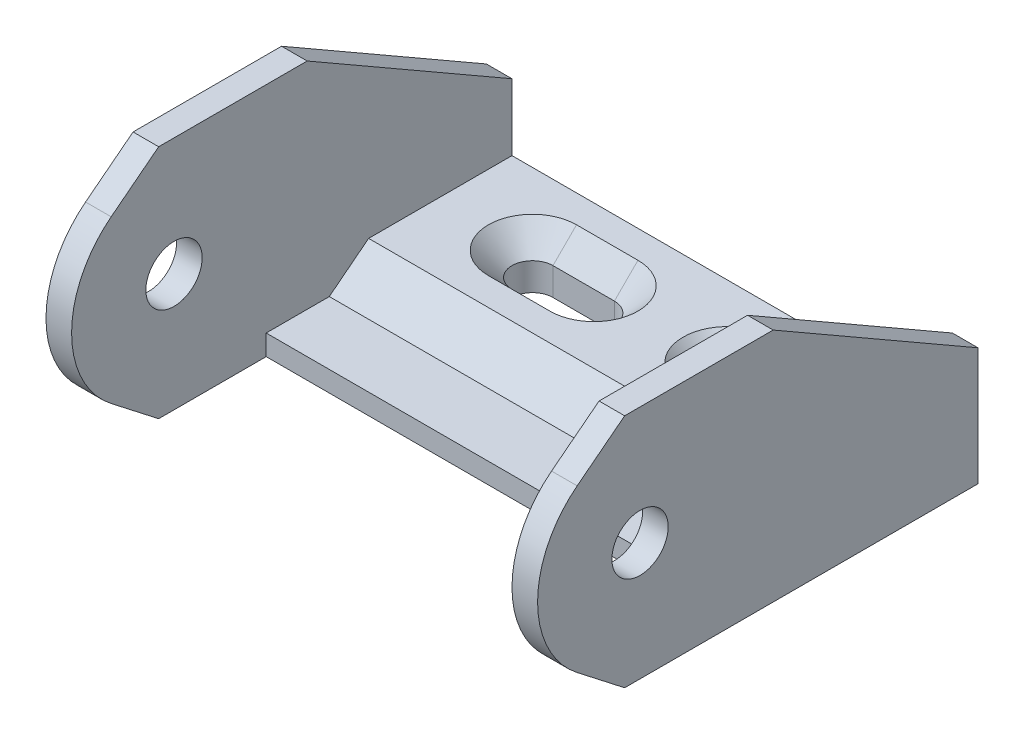
ISO-10303-21;
HEADER;
FILE_DESCRIPTION(('STEP AP214'),'2;1');
FILE_NAME('part.step','',(''),(''),'','','');
FILE_SCHEMA(('AUTOMOTIVE_DESIGN { 1 0 10303 214 1 1 1 1 }'));
ENDSEC;
DATA;
#1=APPLICATION_CONTEXT('core data for automotive mechanical design processes');
#2=APPLICATION_PROTOCOL_DEFINITION('international standard','automotive_design',2000,#1);
#3=PRODUCT_CONTEXT('',#1,'mechanical');
#4=PRODUCT('Part','Part','',(#3));
#5=PRODUCT_RELATED_PRODUCT_CATEGORY('part','',(#4));
#6=PRODUCT_DEFINITION_FORMATION('','',#4);
#7=PRODUCT_DEFINITION_CONTEXT('part definition',#1,'design');
#8=PRODUCT_DEFINITION('design','',#6,#7);
#9=PRODUCT_DEFINITION_SHAPE('','',#8);
#10=(LENGTH_UNIT() NAMED_UNIT(*) SI_UNIT(.MILLI.,.METRE.));
#11=(NAMED_UNIT(*) PLANE_ANGLE_UNIT() SI_UNIT($,.RADIAN.));
#12=(NAMED_UNIT(*) SI_UNIT($,.STERADIAN.) SOLID_ANGLE_UNIT());
#13=UNCERTAINTY_MEASURE_WITH_UNIT(LENGTH_MEASURE(1.E-05),#10,'distance_accuracy_value','');
#14=(GEOMETRIC_REPRESENTATION_CONTEXT(3) GLOBAL_UNCERTAINTY_ASSIGNED_CONTEXT((#13)) GLOBAL_UNIT_ASSIGNED_CONTEXT((#10,
#11,#12)) REPRESENTATION_CONTEXT('',''));
#15=CARTESIAN_POINT('',(0.,0.,0.));
#16=DIRECTION('',(0.,0.,1.));
#17=DIRECTION('',(1.,0.,0.));
#18=AXIS2_PLACEMENT_3D('',#15,#16,#17);
#19=CARTESIAN_POINT('',(24.,-11.5,-17.25));
#20=DIRECTION('',(0.,1.,0.));
#21=DIRECTION('',(0.,0.,1.));
#22=AXIS2_PLACEMENT_3D('',#19,#20,#21);
#23=PLANE('',#22);
#24=DIRECTION('',(0.,0.,-1.));
#25=VECTOR('',#24,1.);
#26=CARTESIAN_POINT('',(-21.5,-11.5,17.25));
#27=LINE('',#26,#25);
#28=CARTESIAN_POINT('',(-21.5,-11.5,17.25));
#29=VERTEX_POINT('',#28);
#30=CARTESIAN_POINT('',(-21.5,-11.5,6.75000000000001));
#31=VERTEX_POINT('',#30);
#32=EDGE_CURVE('E302',#29,#31,#27,.T.);
#33=ORIENTED_EDGE('',*,*,#32,.F.);
#34=DIRECTION('',(-1.,0.,0.));
#35=VECTOR('',#34,1.);
#36=CARTESIAN_POINT('',(24.,-11.5,17.25));
#37=LINE('',#36,#35);
#38=CARTESIAN_POINT('',(-24.,-11.5,17.25));
#39=VERTEX_POINT('',#38);
#40=EDGE_CURVE('E419',#29,#39,#37,.T.);
#41=ORIENTED_EDGE('',*,*,#40,.T.);
#42=DIRECTION('',(0.,0.,-1.));
#43=VECTOR('',#42,1.);
#44=CARTESIAN_POINT('',(-24.,-11.5,-17.25));
#45=LINE('',#44,#43);
#46=CARTESIAN_POINT('',(-24.,-11.5,-17.25));
#47=VERTEX_POINT('',#46);
#48=EDGE_CURVE('E413',#39,#47,#45,.T.);
#49=ORIENTED_EDGE('',*,*,#48,.T.);
#50=DIRECTION('',(-1.,0.,0.));
#51=VECTOR('',#50,1.);
#52=CARTESIAN_POINT('',(24.,-11.5,-17.25));
#53=LINE('',#52,#51);
#54=CARTESIAN_POINT('',(24.,-11.5,-17.25));
#55=VERTEX_POINT('',#54);
#56=EDGE_CURVE('E401',#55,#47,#53,.T.);
#57=ORIENTED_EDGE('',*,*,#56,.F.);
#58=DIRECTION('',(0.,0.,-1.));
#59=VECTOR('',#58,1.);
#60=CARTESIAN_POINT('',(24.,-11.5,-17.25));
#61=LINE('',#60,#59);
#62=CARTESIAN_POINT('',(24.,-11.5,17.25));
#63=VERTEX_POINT('',#62);
#64=EDGE_CURVE('E396',#63,#55,#61,.T.);
#65=ORIENTED_EDGE('',*,*,#64,.F.);
#66=CARTESIAN_POINT('',(21.5,-11.5,17.25));
#67=VERTEX_POINT('',#66);
#68=EDGE_CURVE('E420',#63,#67,#37,.T.);
#69=ORIENTED_EDGE('',*,*,#68,.T.);
#70=DIRECTION('',(0.,0.,-1.));
#71=VECTOR('',#70,1.);
#72=CARTESIAN_POINT('',(21.5,-11.5,17.25));
#73=LINE('',#72,#71);
#74=CARTESIAN_POINT('',(21.5,-11.5,6.75000000000001));
#75=VERTEX_POINT('',#74);
#76=EDGE_CURVE('E334',#67,#75,#73,.T.);
#77=ORIENTED_EDGE('',*,*,#76,.T.);
#78=DIRECTION('',(1.,0.,0.));
#79=VECTOR('',#78,1.);
#80=CARTESIAN_POINT('',(-21.5,-11.5,6.75000000000001));
#81=LINE('',#80,#79);
#82=EDGE_CURVE('E319',#31,#75,#81,.T.);
#83=ORIENTED_EDGE('',*,*,#82,.F.);
#84=EDGE_LOOP('',(#33,#41,#49,#57,#65,#69,#77,#83));
#85=FACE_BOUND('',#84,.T.);
#86=DIRECTION('',(-1.,0.,0.));
#87=VECTOR('',#86,1.);
#88=CARTESIAN_POINT('',(6.5,-11.5,-12.25));
#89=LINE('',#88,#87);
#90=CARTESIAN_POINT('',(12.5,-11.5,-12.25));
#91=VERTEX_POINT('',#90);
#92=CARTESIAN_POINT('',(6.5,-11.5,-12.25));
#93=VERTEX_POINT('',#92);
#94=EDGE_CURVE('E275',#91,#93,#89,.T.);
#95=ORIENTED_EDGE('',*,*,#94,.T.);
#96=CARTESIAN_POINT('',(6.5,-11.5,-10.25));
#97=DIRECTION('',(0.,1.,0.));
#98=DIRECTION('',(0.,0.,1.));
#99=AXIS2_PLACEMENT_3D('',#96,#97,#98);
#100=CIRCLE('',#99,2.);
#101=CARTESIAN_POINT('',(6.5,-11.5,-8.24999999999999));
#102=VERTEX_POINT('',#101);
#103=EDGE_CURVE('E265',#93,#102,#100,.T.);
#104=ORIENTED_EDGE('',*,*,#103,.T.);
#105=DIRECTION('',(1.,0.,0.));
#106=VECTOR('',#105,1.);
#107=CARTESIAN_POINT('',(6.5,-11.5,-8.24999999999999));
#108=LINE('',#107,#106);
#109=CARTESIAN_POINT('',(12.5,-11.5,-8.24999999999999));
#110=VERTEX_POINT('',#109);
#111=EDGE_CURVE('E268',#102,#110,#108,.T.);
#112=ORIENTED_EDGE('',*,*,#111,.T.);
#113=CARTESIAN_POINT('',(12.5,-11.5,-10.25));
#114=DIRECTION('',(0.,1.,0.));
#115=DIRECTION('',(0.,0.,1.));
#116=AXIS2_PLACEMENT_3D('',#113,#114,#115);
#117=CIRCLE('',#116,2.);
#118=EDGE_CURVE('E272',#110,#91,#117,.T.);
#119=ORIENTED_EDGE('',*,*,#118,.T.);
#120=EDGE_LOOP('',(#95,#104,#112,#119));
#121=FACE_BOUND('',#120,.T.);
#122=CARTESIAN_POINT('',(-6.5,-11.5,-10.25));
#123=DIRECTION('',(0.,-1.,0.));
#124=DIRECTION('',(0.,0.,1.));
#125=AXIS2_PLACEMENT_3D('',#122,#123,#124);
#126=CIRCLE('',#125,2.);
#127=CARTESIAN_POINT('',(-6.5,-11.5,-12.25));
#128=VERTEX_POINT('',#127);
#129=CARTESIAN_POINT('',(-6.5,-11.5,-8.24999999999999));
#130=VERTEX_POINT('',#129);
#131=EDGE_CURVE('E245',#128,#130,#126,.T.);
#132=ORIENTED_EDGE('',*,*,#131,.F.);
#133=DIRECTION('',(1.,0.,0.));
#134=VECTOR('',#133,1.);
#135=CARTESIAN_POINT('',(-6.5,-11.5,-12.25));
#136=LINE('',#135,#134);
#137=CARTESIAN_POINT('',(-12.5,-11.5,-12.25));
#138=VERTEX_POINT('',#137);
#139=EDGE_CURVE('E236',#138,#128,#136,.T.);
#140=ORIENTED_EDGE('',*,*,#139,.F.);
#141=CARTESIAN_POINT('',(-12.5,-11.5,-10.25));
#142=DIRECTION('',(0.,-1.,0.));
#143=DIRECTION('',(0.,0.,1.));
#144=AXIS2_PLACEMENT_3D('',#141,#142,#143);
#145=CIRCLE('',#144,2.);
#146=CARTESIAN_POINT('',(-12.5,-11.5,-8.24999999999999));
#147=VERTEX_POINT('',#146);
#148=EDGE_CURVE('E244',#147,#138,#145,.T.);
#149=ORIENTED_EDGE('',*,*,#148,.F.);
#150=DIRECTION('',(-1.,0.,0.));
#151=VECTOR('',#150,1.);
#152=CARTESIAN_POINT('',(-6.5,-11.5,-8.24999999999999));
#153=LINE('',#152,#151);
#154=EDGE_CURVE('E249',#130,#147,#153,.T.);
#155=ORIENTED_EDGE('',*,*,#154,.F.);
#156=EDGE_LOOP('',(#132,#140,#149,#155));
#157=FACE_BOUND('',#156,.T.);
#158=ADVANCED_FACE('F39',(#85,#121,#157),#23,.F.);
#159=CARTESIAN_POINT('',(-21.5,-6.5,-17.25));
#160=DIRECTION('',(0.,-1.,0.));
#161=DIRECTION('',(0.,0.,-1.));
#162=AXIS2_PLACEMENT_3D('',#159,#160,#161);
#163=PLANE('',#162);
#164=CARTESIAN_POINT('',(-6.5,-6.5,-10.25));
#165=DIRECTION('',(0.,-1.,0.));
#166=DIRECTION('',(0.,0.,-1.));
#167=AXIS2_PLACEMENT_3D('',#164,#165,#166);
#168=CIRCLE('',#167,4.29999999999999);
#169=CARTESIAN_POINT('',(-6.5,-6.5,-14.55));
#170=VERTEX_POINT('',#169);
#171=CARTESIAN_POINT('',(-6.5,-6.5,-5.95));
#172=VERTEX_POINT('',#171);
#173=EDGE_CURVE('E463',#170,#172,#168,.T.);
#174=ORIENTED_EDGE('',*,*,#173,.T.);
#175=DIRECTION('',(-1.,0.,0.));
#176=VECTOR('',#175,1.);
#177=CARTESIAN_POINT('',(-12.5,-6.5,-5.95));
#178=LINE('',#177,#176);
#179=CARTESIAN_POINT('',(-12.5,-6.5,-5.95));
#180=VERTEX_POINT('',#179);
#181=EDGE_CURVE('E467',#172,#180,#178,.T.);
#182=ORIENTED_EDGE('',*,*,#181,.T.);
#183=CARTESIAN_POINT('',(-12.5,-6.5,-10.25));
#184=DIRECTION('',(0.,-1.,0.));
#185=DIRECTION('',(0.,0.,-1.));
#186=AXIS2_PLACEMENT_3D('',#183,#184,#185);
#187=CIRCLE('',#186,4.29999999999999);
#188=CARTESIAN_POINT('',(-12.5,-6.5,-14.55));
#189=VERTEX_POINT('',#188);
#190=EDGE_CURVE('E465',#180,#189,#187,.T.);
#191=ORIENTED_EDGE('',*,*,#190,.T.);
#192=DIRECTION('',(1.,0.,0.));
#193=VECTOR('',#192,1.);
#194=CARTESIAN_POINT('',(-6.5,-6.5,-14.55));
#195=LINE('',#194,#193);
#196=EDGE_CURVE('E453',#189,#170,#195,.T.);
#197=ORIENTED_EDGE('',*,*,#196,.T.);
#198=EDGE_LOOP('',(#174,#182,#191,#197));
#199=FACE_BOUND('',#198,.T.);
#200=DIRECTION('',(0.,0.,-1.));
#201=VECTOR('',#200,1.);
#202=CARTESIAN_POINT('',(21.5,-6.5,-17.25));
#203=LINE('',#202,#201);
#204=CARTESIAN_POINT('',(21.5,-6.5,-3.24999999999999));
#205=VERTEX_POINT('',#204);
#206=CARTESIAN_POINT('',(21.5,-6.5,-17.25));
#207=VERTEX_POINT('',#206);
#208=EDGE_CURVE('E346',#205,#207,#203,.T.);
#209=ORIENTED_EDGE('',*,*,#208,.T.);
#210=DIRECTION('',(1.,0.,0.));
#211=VECTOR('',#210,1.);
#212=CARTESIAN_POINT('',(-21.5,-6.5,-17.25));
#213=LINE('',#212,#211);
#214=CARTESIAN_POINT('',(-21.5,-6.5,-17.25));
#215=VERTEX_POINT('',#214);
#216=EDGE_CURVE('E350',#215,#207,#213,.T.);
#217=ORIENTED_EDGE('',*,*,#216,.F.);
#218=DIRECTION('',(0.,0.,-1.));
#219=VECTOR('',#218,1.);
#220=CARTESIAN_POINT('',(-21.5,-6.5,-17.25));
#221=LINE('',#220,#219);
#222=CARTESIAN_POINT('',(-21.5,-6.5,-3.24999999999999));
#223=VERTEX_POINT('',#222);
#224=EDGE_CURVE('E314',#223,#215,#221,.T.);
#225=ORIENTED_EDGE('',*,*,#224,.F.);
#226=DIRECTION('',(1.,0.,0.));
#227=VECTOR('',#226,1.);
#228=CARTESIAN_POINT('',(-21.5,-6.5,-3.24999999999999));
#229=LINE('',#228,#227);
#230=EDGE_CURVE('E354',#223,#205,#229,.T.);
#231=ORIENTED_EDGE('',*,*,#230,.T.);
#232=EDGE_LOOP('',(#209,#217,#225,#231));
#233=FACE_BOUND('',#232,.T.);
#234=CARTESIAN_POINT('',(12.5,-6.5,-10.25));
#235=DIRECTION('',(0.,-1.,0.));
#236=DIRECTION('',(0.,0.,-1.));
#237=AXIS2_PLACEMENT_3D('',#234,#235,#236);
#238=CIRCLE('',#237,4.29999999999999);
#239=CARTESIAN_POINT('',(12.5,-6.5,-14.55));
#240=VERTEX_POINT('',#239);
#241=CARTESIAN_POINT('',(12.5,-6.5,-5.95));
#242=VERTEX_POINT('',#241);
#243=EDGE_CURVE('E442',#240,#242,#238,.T.);
#244=ORIENTED_EDGE('',*,*,#243,.T.);
#245=DIRECTION('',(-1.,0.,0.));
#246=VECTOR('',#245,1.);
#247=CARTESIAN_POINT('',(-21.5,-6.5,-5.95));
#248=LINE('',#247,#246);
#249=CARTESIAN_POINT('',(6.5,-6.5,-5.95));
#250=VERTEX_POINT('',#249);
#251=EDGE_CURVE('E444',#242,#250,#248,.T.);
#252=ORIENTED_EDGE('',*,*,#251,.T.);
#253=CARTESIAN_POINT('',(6.5,-6.5,-10.25));
#254=DIRECTION('',(0.,-1.,0.));
#255=DIRECTION('',(0.,0.,-1.));
#256=AXIS2_PLACEMENT_3D('',#253,#254,#255);
#257=CIRCLE('',#256,4.29999999999999);
#258=CARTESIAN_POINT('',(6.5,-6.5,-14.55));
#259=VERTEX_POINT('',#258);
#260=EDGE_CURVE('E440',#250,#259,#257,.T.);
#261=ORIENTED_EDGE('',*,*,#260,.T.);
#262=DIRECTION('',(1.,0.,0.));
#263=VECTOR('',#262,1.);
#264=CARTESIAN_POINT('',(-21.5,-6.5,-14.55));
#265=LINE('',#264,#263);
#266=EDGE_CURVE('E438',#259,#240,#265,.T.);
#267=ORIENTED_EDGE('',*,*,#266,.T.);
#268=EDGE_LOOP('',(#244,#252,#261,#267));
#269=FACE_BOUND('',#268,.T.);
#270=ADVANCED_FACE('F491',(#199,#233,#269),#163,.F.);
#271=CARTESIAN_POINT('',(24.,11.5,-17.25));
#272=DIRECTION('',(0.,-1.,0.));
#273=DIRECTION('',(0.,0.,-1.));
#274=AXIS2_PLACEMENT_3D('',#271,#272,#273);
#275=PLANE('',#274);
#276=DIRECTION('',(0.,0.,1.));
#277=VECTOR('',#276,1.);
#278=CARTESIAN_POINT('',(-21.5,11.5,2.75000000000001));
#279=LINE('',#278,#277);
#280=CARTESIAN_POINT('',(-21.5,11.5,2.75000000000001));
#281=VERTEX_POINT('',#280);
#282=CARTESIAN_POINT('',(-21.5,11.5,17.25));
#283=VERTEX_POINT('',#282);
#284=EDGE_CURVE('E293',#281,#283,#279,.T.);
#285=ORIENTED_EDGE('',*,*,#284,.F.);
#286=DIRECTION('',(1.,0.,0.));
#287=VECTOR('',#286,1.);
#288=CARTESIAN_POINT('',(-24.,11.5,2.75000000000001));
#289=LINE('',#288,#287);
#290=CARTESIAN_POINT('',(-24.,11.5,2.75000000000001));
#291=VERTEX_POINT('',#290);
#292=EDGE_CURVE('E380',#291,#281,#289,.T.);
#293=ORIENTED_EDGE('',*,*,#292,.F.);
#294=DIRECTION('',(0.,0.,1.));
#295=VECTOR('',#294,1.);
#296=CARTESIAN_POINT('',(-24.,11.5,-17.25));
#297=LINE('',#296,#295);
#298=CARTESIAN_POINT('',(-24.,11.5,17.25));
#299=VERTEX_POINT('',#298);
#300=EDGE_CURVE('E378',#291,#299,#297,.T.);
#301=ORIENTED_EDGE('',*,*,#300,.T.);
#302=DIRECTION('',(-1.,0.,0.));
#303=VECTOR('',#302,1.);
#304=CARTESIAN_POINT('',(24.,11.5,17.25));
#305=LINE('',#304,#303);
#306=EDGE_CURVE('E431',#283,#299,#305,.T.);
#307=ORIENTED_EDGE('',*,*,#306,.F.);
#308=EDGE_LOOP('',(#285,#293,#301,#307));
#309=FACE_BOUND('',#308,.T.);
#310=ADVANCED_FACE('F518',(#309),#275,.F.);
#311=CARTESIAN_POINT('',(24.,11.5,17.25));
#312=DIRECTION('',(0.,-0.789512973283621,-0.613733871492243));
#313=DIRECTION('',(0.,0.613733871492243,-0.789512973283621));
#314=AXIS2_PLACEMENT_3D('',#311,#312,#313);
#315=PLANE('',#314);
#316=DIRECTION('',(0.,-0.613733871492243,0.789512973283621));
#317=VECTOR('',#316,1.);
#318=CARTESIAN_POINT('',(-21.5,11.5,17.25));
#319=LINE('',#318,#317);
#320=CARTESIAN_POINT('',(-21.5,7.8951297328362,21.8873387149224));
#321=VERTEX_POINT('',#320);
#322=EDGE_CURVE('E296',#283,#321,#319,.T.);
#323=ORIENTED_EDGE('',*,*,#322,.F.);
#324=ORIENTED_EDGE('',*,*,#306,.T.);
#325=DIRECTION('',(0.,-0.613733871492243,0.789512973283621));
#326=VECTOR('',#325,1.);
#327=CARTESIAN_POINT('',(-24.,11.5,17.25));
#328=LINE('',#327,#326);
#329=CARTESIAN_POINT('',(-24.,7.8951297328362,21.8873387149224));
#330=VERTEX_POINT('',#329);
#331=EDGE_CURVE('E404',#299,#330,#328,.T.);
#332=ORIENTED_EDGE('',*,*,#331,.T.);
#333=DIRECTION('',(-1.,0.,0.));
#334=VECTOR('',#333,1.);
#335=CARTESIAN_POINT('',(24.,7.8951297328362,21.8873387149224));
#336=LINE('',#335,#334);
#337=EDGE_CURVE('E427',#321,#330,#336,.T.);
#338=ORIENTED_EDGE('',*,*,#337,.F.);
#339=EDGE_LOOP('',(#323,#324,#332,#338));
#340=FACE_BOUND('',#339,.T.);
#341=ADVANCED_FACE('F542',(#340),#315,.F.);
#342=CARTESIAN_POINT('',(24.,0.,15.75));
#343=DIRECTION('',(-1.,0.,0.));
#344=DIRECTION('',(0.,0.,1.));
#345=AXIS2_PLACEMENT_3D('',#342,#343,#344);
#346=CYLINDRICAL_SURFACE('',#345,10.);
#347=CARTESIAN_POINT('',(-21.5,0.,15.75));
#348=DIRECTION('',(1.,0.,0.));
#349=DIRECTION('',(0.,0.,-1.));
#350=AXIS2_PLACEMENT_3D('',#347,#348,#349);
#351=CIRCLE('',#350,10.);
#352=CARTESIAN_POINT('',(-21.5,-7.89512973283621,21.8873387149224));
#353=VERTEX_POINT('',#352);
#354=EDGE_CURVE('E298',#321,#353,#351,.T.);
#355=ORIENTED_EDGE('',*,*,#354,.F.);
#356=ORIENTED_EDGE('',*,*,#337,.T.);
#357=CARTESIAN_POINT('',(-24.,0.,15.75));
#358=DIRECTION('',(1.,0.,0.));
#359=DIRECTION('',(0.,0.,-1.));
#360=AXIS2_PLACEMENT_3D('',#357,#358,#359);
#361=CIRCLE('',#360,10.);
#362=CARTESIAN_POINT('',(-24.,-7.89512973283621,21.8873387149224));
#363=VERTEX_POINT('',#362);
#364=EDGE_CURVE('E407',#330,#363,#361,.T.);
#365=ORIENTED_EDGE('',*,*,#364,.T.);
#366=DIRECTION('',(-1.,0.,0.));
#367=VECTOR('',#366,1.);
#368=CARTESIAN_POINT('',(24.,-7.89512973283621,21.8873387149224));
#369=LINE('',#368,#367);
#370=EDGE_CURVE('E423',#353,#363,#369,.T.);
#371=ORIENTED_EDGE('',*,*,#370,.F.);
#372=EDGE_LOOP('',(#355,#356,#365,#371));
#373=FACE_BOUND('',#372,.T.);
#374=ADVANCED_FACE('F537',(#373),#346,.T.);
#375=CARTESIAN_POINT('',(24.,-7.89512973283621,21.8873387149224));
#376=DIRECTION('',(0.,0.789512973283621,-0.613733871492243));
#377=DIRECTION('',(0.,0.613733871492243,0.789512973283621));
#378=AXIS2_PLACEMENT_3D('',#375,#376,#377);
#379=PLANE('',#378);
#380=DIRECTION('',(0.,-0.613733871492243,-0.789512973283621));
#381=VECTOR('',#380,1.);
#382=CARTESIAN_POINT('',(-21.5,-7.89512973283621,21.8873387149224));
#383=LINE('',#382,#381);
#384=EDGE_CURVE('E300',#353,#29,#383,.T.);
#385=ORIENTED_EDGE('',*,*,#384,.F.);
#386=ORIENTED_EDGE('',*,*,#370,.T.);
#387=DIRECTION('',(0.,-0.613733871492243,-0.789512973283621));
#388=VECTOR('',#387,1.);
#389=CARTESIAN_POINT('',(-24.,-7.89512973283621,21.8873387149224));
#390=LINE('',#389,#388);
#391=EDGE_CURVE('E410',#363,#39,#390,.T.);
#392=ORIENTED_EDGE('',*,*,#391,.T.);
#393=ORIENTED_EDGE('',*,*,#40,.F.);
#394=EDGE_LOOP('',(#385,#386,#392,#393));
#395=FACE_BOUND('',#394,.T.);
#396=ADVANCED_FACE('F532',(#395),#379,.F.);
#397=CARTESIAN_POINT('',(24.,-11.5,-17.25));
#398=DIRECTION('',(0.,0.,1.));
#399=DIRECTION('',(1.,0.,0.));
#400=AXIS2_PLACEMENT_3D('',#397,#398,#399);
#401=PLANE('',#400);
#402=DIRECTION('',(0.,1.,0.));
#403=VECTOR('',#402,1.);
#404=CARTESIAN_POINT('',(-21.5,-6.5,-17.25));
#405=LINE('',#404,#403);
#406=CARTESIAN_POINT('',(-21.5,0.,-17.25));
#407=VERTEX_POINT('',#406);
#408=EDGE_CURVE('E317',#215,#407,#405,.T.);
#409=ORIENTED_EDGE('',*,*,#408,.F.);
#410=ORIENTED_EDGE('',*,*,#216,.T.);
#411=DIRECTION('',(0.,1.,0.));
#412=VECTOR('',#411,1.);
#413=CARTESIAN_POINT('',(21.5,-6.5,-17.25));
#414=LINE('',#413,#412);
#415=CARTESIAN_POINT('',(21.5,0.,-17.25));
#416=VERTEX_POINT('',#415);
#417=EDGE_CURVE('E294',#207,#416,#414,.T.);
#418=ORIENTED_EDGE('',*,*,#417,.T.);
#419=DIRECTION('',(1.,0.,0.));
#420=VECTOR('',#419,1.);
#421=CARTESIAN_POINT('',(-24.,0.,-17.25));
#422=LINE('',#421,#420);
#423=CARTESIAN_POINT('',(24.,0.,-17.25));
#424=VERTEX_POINT('',#423);
#425=EDGE_CURVE('E379',#416,#424,#422,.T.);
#426=ORIENTED_EDGE('',*,*,#425,.T.);
#427=DIRECTION('',(0.,1.,0.));
#428=VECTOR('',#427,1.);
#429=CARTESIAN_POINT('',(24.,-11.5,-17.25));
#430=LINE('',#429,#428);
#431=EDGE_CURVE('E398',#55,#424,#430,.T.);
#432=ORIENTED_EDGE('',*,*,#431,.F.);
#433=ORIENTED_EDGE('',*,*,#56,.T.);
#434=DIRECTION('',(0.,1.,0.));
#435=VECTOR('',#434,1.);
#436=CARTESIAN_POINT('',(-24.,-11.5,-17.25));
#437=LINE('',#436,#435);
#438=CARTESIAN_POINT('',(-24.,0.,-17.25));
#439=VERTEX_POINT('',#438);
#440=EDGE_CURVE('E390',#47,#439,#437,.T.);
#441=ORIENTED_EDGE('',*,*,#440,.T.);
#442=EDGE_CURVE('E375',#439,#407,#422,.T.);
#443=ORIENTED_EDGE('',*,*,#442,.T.);
#444=EDGE_LOOP('',(#409,#410,#418,#426,#432,#433,#441,#443));
#445=FACE_BOUND('',#444,.T.);
#446=ADVANCED_FACE('F524',(#445),#401,.F.);
#447=CARTESIAN_POINT('',(-24.,0.,15.75));
#448=DIRECTION('',(1.,0.,0.));
#449=DIRECTION('',(0.,0.,-1.));
#450=AXIS2_PLACEMENT_3D('',#447,#448,#449);
#451=CYLINDRICAL_SURFACE('',#450,2.75);
#452=CARTESIAN_POINT('',(-24.,0.,15.75));
#453=DIRECTION('',(1.,0.,0.));
#454=DIRECTION('',(0.,0.,-1.));
#455=AXIS2_PLACEMENT_3D('',#452,#453,#454);
#456=CIRCLE('',#455,2.75);
#457=CARTESIAN_POINT('',(-24.,0.,13.));
#458=VERTEX_POINT('',#457);
#459=EDGE_CURVE('E374',#458,#458,#456,.T.);
#460=ORIENTED_EDGE('',*,*,#459,.F.);
#461=EDGE_LOOP('',(#460));
#462=FACE_BOUND('',#461,.T.);
#463=CARTESIAN_POINT('',(-21.5,0.,15.75));
#464=DIRECTION('',(1.,0.,0.));
#465=DIRECTION('',(0.,0.,-1.));
#466=AXIS2_PLACEMENT_3D('',#463,#464,#465);
#467=CIRCLE('',#466,2.75);
#468=CARTESIAN_POINT('',(-21.5,0.,13.));
#469=VERTEX_POINT('',#468);
#470=EDGE_CURVE('E363',#469,#469,#467,.F.);
#471=ORIENTED_EDGE('',*,*,#470,.F.);
#472=EDGE_LOOP('',(#471));
#473=FACE_BOUND('',#472,.T.);
#474=ADVANCED_FACE('F738',(#462,#473),#451,.F.);
#475=CARTESIAN_POINT('',(-24.,0.,-17.25));
#476=DIRECTION('',(0.,-0.866906303057535,0.498471124258083));
#477=DIRECTION('',(0.,-0.498471124258083,-0.866906303057535));
#478=AXIS2_PLACEMENT_3D('',#475,#476,#477);
#479=PLANE('',#478);
#480=DIRECTION('',(0.,0.498471124258083,0.866906303057535));
#481=VECTOR('',#480,1.);
#482=CARTESIAN_POINT('',(-21.5,11.5,2.75000000000001));
#483=LINE('',#482,#481);
#484=EDGE_CURVE('E291',#407,#281,#483,.T.);
#485=ORIENTED_EDGE('',*,*,#484,.F.);
#486=ORIENTED_EDGE('',*,*,#442,.F.);
#487=DIRECTION('',(0.,-0.498471124258083,-0.866906303057535));
#488=VECTOR('',#487,1.);
#489=CARTESIAN_POINT('',(-24.,0.,-17.25));
#490=LINE('',#489,#488);
#491=EDGE_CURVE('E367',#291,#439,#490,.T.);
#492=ORIENTED_EDGE('',*,*,#491,.F.);
#493=ORIENTED_EDGE('',*,*,#292,.T.);
#494=EDGE_LOOP('',(#485,#486,#492,#493));
#495=FACE_BOUND('',#494,.T.);
#496=ADVANCED_FACE('F545',(#495),#479,.F.);
#497=CARTESIAN_POINT('',(21.5,11.5,2.75000000000001));
#498=VERTEX_POINT('',#497);
#499=CARTESIAN_POINT('',(24.,11.5,2.75000000000001));
#500=VERTEX_POINT('',#499);
#501=EDGE_CURVE('E370',#498,#500,#289,.T.);
#502=ORIENTED_EDGE('',*,*,#501,.F.);
#503=DIRECTION('',(0.,0.,1.));
#504=VECTOR('',#503,1.);
#505=CARTESIAN_POINT('',(21.5,11.5,2.75000000000001));
#506=LINE('',#505,#504);
#507=CARTESIAN_POINT('',(21.5,11.5,17.25));
#508=VERTEX_POINT('',#507);
#509=EDGE_CURVE('E322',#498,#508,#506,.T.);
#510=ORIENTED_EDGE('',*,*,#509,.T.);
#511=CARTESIAN_POINT('',(24.,11.5,17.25));
#512=VERTEX_POINT('',#511);
#513=EDGE_CURVE('E432',#512,#508,#305,.T.);
#514=ORIENTED_EDGE('',*,*,#513,.F.);
#515=DIRECTION('',(0.,0.,1.));
#516=VECTOR('',#515,1.);
#517=CARTESIAN_POINT('',(24.,11.5,-17.25));
#518=LINE('',#517,#516);
#519=EDGE_CURVE('E387',#500,#512,#518,.T.);
#520=ORIENTED_EDGE('',*,*,#519,.F.);
#521=EDGE_LOOP('',(#502,#510,#514,#520));
#522=FACE_BOUND('',#521,.T.);
#523=ADVANCED_FACE('F540',(#522),#275,.F.);
#524=ORIENTED_EDGE('',*,*,#513,.T.);
#525=DIRECTION('',(0.,-0.613733871492243,0.789512973283621));
#526=VECTOR('',#525,1.);
#527=CARTESIAN_POINT('',(21.5,11.5,17.25));
#528=LINE('',#527,#526);
#529=CARTESIAN_POINT('',(21.5,7.8951297328362,21.8873387149224));
#530=VERTEX_POINT('',#529);
#531=EDGE_CURVE('E325',#508,#530,#528,.T.);
#532=ORIENTED_EDGE('',*,*,#531,.T.);
#533=CARTESIAN_POINT('',(24.,7.8951297328362,21.8873387149224));
#534=VERTEX_POINT('',#533);
#535=EDGE_CURVE('E428',#534,#530,#336,.T.);
#536=ORIENTED_EDGE('',*,*,#535,.F.);
#537=DIRECTION('',(0.,-0.613733871492243,0.789512973283621));
#538=VECTOR('',#537,1.);
#539=CARTESIAN_POINT('',(24.,11.5,17.25));
#540=LINE('',#539,#538);
#541=EDGE_CURVE('E389',#512,#534,#540,.T.);
#542=ORIENTED_EDGE('',*,*,#541,.F.);
#543=EDGE_LOOP('',(#524,#532,#536,#542));
#544=FACE_BOUND('',#543,.T.);
#545=ADVANCED_FACE('F535',(#544),#315,.F.);
#546=ORIENTED_EDGE('',*,*,#535,.T.);
#547=CARTESIAN_POINT('',(21.5,0.,15.75));
#548=DIRECTION('',(1.,0.,0.));
#549=DIRECTION('',(0.,0.,-1.));
#550=AXIS2_PLACEMENT_3D('',#547,#548,#549);
#551=CIRCLE('',#550,10.);
#552=CARTESIAN_POINT('',(21.5,-7.89512973283621,21.8873387149224));
#553=VERTEX_POINT('',#552);
#554=EDGE_CURVE('E328',#530,#553,#551,.T.);
#555=ORIENTED_EDGE('',*,*,#554,.T.);
#556=CARTESIAN_POINT('',(24.,-7.89512973283621,21.8873387149224));
#557=VERTEX_POINT('',#556);
#558=EDGE_CURVE('E424',#557,#553,#369,.T.);
#559=ORIENTED_EDGE('',*,*,#558,.F.);
#560=CARTESIAN_POINT('',(24.,0.,15.75));
#561=DIRECTION('',(1.,0.,0.));
#562=DIRECTION('',(0.,0.,-1.));
#563=AXIS2_PLACEMENT_3D('',#560,#561,#562);
#564=CIRCLE('',#563,10.);
#565=EDGE_CURVE('E392',#534,#557,#564,.T.);
#566=ORIENTED_EDGE('',*,*,#565,.F.);
#567=EDGE_LOOP('',(#546,#555,#559,#566));
#568=FACE_BOUND('',#567,.T.);
#569=ADVANCED_FACE('F530',(#568),#346,.T.);
#570=ORIENTED_EDGE('',*,*,#558,.T.);
#571=DIRECTION('',(0.,-0.613733871492243,-0.789512973283621));
#572=VECTOR('',#571,1.);
#573=CARTESIAN_POINT('',(21.5,-7.89512973283621,21.8873387149224));
#574=LINE('',#573,#572);
#575=EDGE_CURVE('E331',#553,#67,#574,.T.);
#576=ORIENTED_EDGE('',*,*,#575,.T.);
#577=ORIENTED_EDGE('',*,*,#68,.F.);
#578=DIRECTION('',(0.,-0.613733871492243,-0.789512973283621));
#579=VECTOR('',#578,1.);
#580=CARTESIAN_POINT('',(24.,-7.89512973283621,21.8873387149224));
#581=LINE('',#580,#579);
#582=EDGE_CURVE('E394',#557,#63,#581,.T.);
#583=ORIENTED_EDGE('',*,*,#582,.F.);
#584=EDGE_LOOP('',(#570,#576,#577,#583));
#585=FACE_BOUND('',#584,.T.);
#586=ADVANCED_FACE('F526',(#585),#379,.F.);
#587=CARTESIAN_POINT('',(24.,0.,15.75));
#588=DIRECTION('',(1.,0.,0.));
#589=DIRECTION('',(0.,0.,-1.));
#590=AXIS2_PLACEMENT_3D('',#587,#588,#589);
#591=PLANE('',#590);
#592=DIRECTION('',(0.,-0.498471124258083,-0.866906303057535));
#593=VECTOR('',#592,1.);
#594=CARTESIAN_POINT('',(24.,0.,-17.25));
#595=LINE('',#594,#593);
#596=EDGE_CURVE('E371',#500,#424,#595,.T.);
#597=ORIENTED_EDGE('',*,*,#596,.F.);
#598=ORIENTED_EDGE('',*,*,#519,.T.);
#599=ORIENTED_EDGE('',*,*,#541,.T.);
#600=ORIENTED_EDGE('',*,*,#565,.T.);
#601=ORIENTED_EDGE('',*,*,#582,.T.);
#602=ORIENTED_EDGE('',*,*,#64,.T.);
#603=ORIENTED_EDGE('',*,*,#431,.T.);
#604=EDGE_LOOP('',(#597,#598,#599,#600,#601,#602,#603));
#605=FACE_BOUND('',#604,.T.);
#606=CARTESIAN_POINT('',(24.,0.,15.75));
#607=DIRECTION('',(1.,0.,0.));
#608=DIRECTION('',(0.,0.,-1.));
#609=AXIS2_PLACEMENT_3D('',#606,#607,#608);
#610=CIRCLE('',#609,2.75);
#611=CARTESIAN_POINT('',(24.,0.,13.));
#612=VERTEX_POINT('',#611);
#613=EDGE_CURVE('E366',#612,#612,#610,.T.);
#614=ORIENTED_EDGE('',*,*,#613,.F.);
#615=EDGE_LOOP('',(#614));
#616=FACE_BOUND('',#615,.T.);
#617=ADVANCED_FACE('F529',(#605,#616),#591,.T.);
#618=CARTESIAN_POINT('',(-24.,0.,15.75));
#619=DIRECTION('',(1.,0.,0.));
#620=DIRECTION('',(0.,0.,-1.));
#621=AXIS2_PLACEMENT_3D('',#618,#619,#620);
#622=PLANE('',#621);
#623=ORIENTED_EDGE('',*,*,#459,.T.);
#624=EDGE_LOOP('',(#623));
#625=FACE_BOUND('',#624,.T.);
#626=ORIENTED_EDGE('',*,*,#300,.F.);
#627=ORIENTED_EDGE('',*,*,#491,.T.);
#628=ORIENTED_EDGE('',*,*,#440,.F.);
#629=ORIENTED_EDGE('',*,*,#48,.F.);
#630=ORIENTED_EDGE('',*,*,#391,.F.);
#631=ORIENTED_EDGE('',*,*,#364,.F.);
#632=ORIENTED_EDGE('',*,*,#331,.F.);
#633=EDGE_LOOP('',(#626,#627,#628,#629,#630,#631,#632));
#634=FACE_BOUND('',#633,.T.);
#635=ADVANCED_FACE('F765',(#625,#634),#622,.F.);
#636=CARTESIAN_POINT('',(21.5,0.,15.75));
#637=DIRECTION('',(1.,0.,0.));
#638=DIRECTION('',(0.,0.,-1.));
#639=AXIS2_PLACEMENT_3D('',#636,#637,#638);
#640=CIRCLE('',#639,2.75);
#641=CARTESIAN_POINT('',(21.5,0.,13.));
#642=VERTEX_POINT('',#641);
#643=EDGE_CURVE('E353',#642,#642,#640,.F.);
#644=ORIENTED_EDGE('',*,*,#643,.T.);
#645=EDGE_LOOP('',(#644));
#646=FACE_BOUND('',#645,.T.);
#647=ORIENTED_EDGE('',*,*,#613,.T.);
#648=EDGE_LOOP('',(#647));
#649=FACE_BOUND('',#648,.T.);
#650=ADVANCED_FACE('F747',(#646,#649),#451,.F.);
#651=ORIENTED_EDGE('',*,*,#425,.F.);
#652=DIRECTION('',(0.,0.498471124258083,0.866906303057535));
#653=VECTOR('',#652,1.);
#654=CARTESIAN_POINT('',(21.5,11.5,2.75000000000001));
#655=LINE('',#654,#653);
#656=EDGE_CURVE('E282',#416,#498,#655,.T.);
#657=ORIENTED_EDGE('',*,*,#656,.T.);
#658=ORIENTED_EDGE('',*,*,#501,.T.);
#659=ORIENTED_EDGE('',*,*,#596,.T.);
#660=EDGE_LOOP('',(#651,#657,#658,#659));
#661=FACE_BOUND('',#660,.T.);
#662=ADVANCED_FACE('F704',(#661),#479,.F.);
#663=CARTESIAN_POINT('',(-21.5,0.,15.75));
#664=DIRECTION('',(1.,0.,0.));
#665=DIRECTION('',(0.,0.,-1.));
#666=AXIS2_PLACEMENT_3D('',#663,#664,#665);
#667=PLANE('',#666);
#668=ORIENTED_EDGE('',*,*,#484,.T.);
#669=ORIENTED_EDGE('',*,*,#284,.T.);
#670=ORIENTED_EDGE('',*,*,#322,.T.);
#671=ORIENTED_EDGE('',*,*,#354,.T.);
#672=ORIENTED_EDGE('',*,*,#384,.T.);
#673=ORIENTED_EDGE('',*,*,#32,.T.);
#674=DIRECTION('',(0.,1.,0.));
#675=VECTOR('',#674,1.);
#676=CARTESIAN_POINT('',(-21.5,-9.5,6.75000000000001));
#677=LINE('',#676,#675);
#678=CARTESIAN_POINT('',(-21.5,-9.5,6.75000000000001));
#679=VERTEX_POINT('',#678);
#680=EDGE_CURVE('E305',#31,#679,#677,.T.);
#681=ORIENTED_EDGE('',*,*,#680,.T.);
#682=DIRECTION('',(0.,0.,-1.));
#683=VECTOR('',#682,1.);
#684=CARTESIAN_POINT('',(-21.5,-9.5,0.589824896579225));
#685=LINE('',#684,#683);
#686=CARTESIAN_POINT('',(-21.5,-9.5,0.589824896579225));
#687=VERTEX_POINT('',#686);
#688=EDGE_CURVE('E308',#679,#687,#685,.T.);
#689=ORIENTED_EDGE('',*,*,#688,.T.);
#690=DIRECTION('',(0.,0.61566147532566,-0.788010753606721));
#691=VECTOR('',#690,1.);
#692=CARTESIAN_POINT('',(-21.5,-6.5,-3.24999999999999));
#693=LINE('',#692,#691);
#694=EDGE_CURVE('E311',#687,#223,#693,.T.);
#695=ORIENTED_EDGE('',*,*,#694,.T.);
#696=ORIENTED_EDGE('',*,*,#224,.T.);
#697=ORIENTED_EDGE('',*,*,#408,.T.);
#698=EDGE_LOOP('',(#668,#669,#670,#671,#672,#673,#681,#689,#695,#696,#697));
#699=FACE_BOUND('',#698,.T.);
#700=ORIENTED_EDGE('',*,*,#470,.T.);
#701=EDGE_LOOP('',(#700));
#702=FACE_BOUND('',#701,.T.);
#703=ADVANCED_FACE('F696',(#699,#702),#667,.T.);
#704=CARTESIAN_POINT('',(21.5,0.,15.75));
#705=DIRECTION('',(1.,0.,0.));
#706=DIRECTION('',(0.,0.,-1.));
#707=AXIS2_PLACEMENT_3D('',#704,#705,#706);
#708=PLANE('',#707);
#709=ORIENTED_EDGE('',*,*,#656,.F.);
#710=ORIENTED_EDGE('',*,*,#417,.F.);
#711=ORIENTED_EDGE('',*,*,#208,.F.);
#712=DIRECTION('',(0.,0.61566147532566,-0.788010753606721));
#713=VECTOR('',#712,1.);
#714=CARTESIAN_POINT('',(21.5,-6.5,-3.24999999999999));
#715=LINE('',#714,#713);
#716=CARTESIAN_POINT('',(21.5,-9.5,0.589824896579225));
#717=VERTEX_POINT('',#716);
#718=EDGE_CURVE('E343',#717,#205,#715,.T.);
#719=ORIENTED_EDGE('',*,*,#718,.F.);
#720=DIRECTION('',(0.,0.,-1.));
#721=VECTOR('',#720,1.);
#722=CARTESIAN_POINT('',(21.5,-9.5,0.589824896579225));
#723=LINE('',#722,#721);
#724=CARTESIAN_POINT('',(21.5,-9.5,6.75000000000001));
#725=VERTEX_POINT('',#724);
#726=EDGE_CURVE('E340',#725,#717,#723,.T.);
#727=ORIENTED_EDGE('',*,*,#726,.F.);
#728=DIRECTION('',(0.,1.,0.));
#729=VECTOR('',#728,1.);
#730=CARTESIAN_POINT('',(21.5,-9.5,6.75000000000001));
#731=LINE('',#730,#729);
#732=EDGE_CURVE('E337',#75,#725,#731,.T.);
#733=ORIENTED_EDGE('',*,*,#732,.F.);
#734=ORIENTED_EDGE('',*,*,#76,.F.);
#735=ORIENTED_EDGE('',*,*,#575,.F.);
#736=ORIENTED_EDGE('',*,*,#554,.F.);
#737=ORIENTED_EDGE('',*,*,#531,.F.);
#738=ORIENTED_EDGE('',*,*,#509,.F.);
#739=EDGE_LOOP('',(#709,#710,#711,#719,#727,#733,#734,#735,#736,#737,#738));
#740=FACE_BOUND('',#739,.T.);
#741=ORIENTED_EDGE('',*,*,#643,.F.);
#742=EDGE_LOOP('',(#741));
#743=FACE_BOUND('',#742,.T.);
#744=ADVANCED_FACE('F688',(#740,#743),#708,.F.);
#745=CARTESIAN_POINT('',(-21.5,-6.5,-3.24999999999999));
#746=DIRECTION('',(0.,-0.788010753606721,-0.61566147532566));
#747=DIRECTION('',(0.,0.61566147532566,-0.788010753606721));
#748=AXIS2_PLACEMENT_3D('',#745,#746,#747);
#749=PLANE('',#748);
#750=ORIENTED_EDGE('',*,*,#718,.T.);
#751=ORIENTED_EDGE('',*,*,#230,.F.);
#752=ORIENTED_EDGE('',*,*,#694,.F.);
#753=DIRECTION('',(1.,0.,0.));
#754=VECTOR('',#753,1.);
#755=CARTESIAN_POINT('',(-21.5,-9.5,0.589824896579225));
#756=LINE('',#755,#754);
#757=EDGE_CURVE('E356',#687,#717,#756,.T.);
#758=ORIENTED_EDGE('',*,*,#757,.T.);
#759=EDGE_LOOP('',(#750,#751,#752,#758));
#760=FACE_BOUND('',#759,.T.);
#761=ADVANCED_FACE('F680',(#760),#749,.F.);
#762=CARTESIAN_POINT('',(-21.5,-9.5,0.589824896579225));
#763=DIRECTION('',(0.,-1.,0.));
#764=DIRECTION('',(0.,0.,-1.));
#765=AXIS2_PLACEMENT_3D('',#762,#763,#764);
#766=PLANE('',#765);
#767=ORIENTED_EDGE('',*,*,#726,.T.);
#768=ORIENTED_EDGE('',*,*,#757,.F.);
#769=ORIENTED_EDGE('',*,*,#688,.F.);
#770=DIRECTION('',(1.,0.,0.));
#771=VECTOR('',#770,1.);
#772=CARTESIAN_POINT('',(-21.5,-9.5,6.75000000000001));
#773=LINE('',#772,#771);
#774=EDGE_CURVE('E358',#679,#725,#773,.T.);
#775=ORIENTED_EDGE('',*,*,#774,.T.);
#776=EDGE_LOOP('',(#767,#768,#769,#775));
#777=FACE_BOUND('',#776,.T.);
#778=ADVANCED_FACE('F672',(#777),#766,.F.);
#779=CARTESIAN_POINT('',(-21.5,-9.5,6.75000000000001));
#780=DIRECTION('',(0.,0.,-1.));
#781=DIRECTION('',(0.,1.,0.));
#782=AXIS2_PLACEMENT_3D('',#779,#780,#781);
#783=PLANE('',#782);
#784=ORIENTED_EDGE('',*,*,#732,.T.);
#785=ORIENTED_EDGE('',*,*,#774,.F.);
#786=ORIENTED_EDGE('',*,*,#680,.F.);
#787=ORIENTED_EDGE('',*,*,#82,.T.);
#788=EDGE_LOOP('',(#784,#785,#786,#787));
#789=FACE_BOUND('',#788,.T.);
#790=ADVANCED_FACE('F664',(#789),#783,.F.);
#791=CARTESIAN_POINT('',(6.5,-11.5,-10.25));
#792=DIRECTION('',(0.,1.,0.));
#793=DIRECTION('',(0.,0.,1.));
#794=AXIS2_PLACEMENT_3D('',#791,#792,#793);
#795=CYLINDRICAL_SURFACE('',#794,2.);
#796=DIRECTION('',(0.,1.,0.));
#797=VECTOR('',#796,1.);
#798=CARTESIAN_POINT('',(6.5,-11.5,-12.25));
#799=LINE('',#798,#797);
#800=CARTESIAN_POINT('',(6.5,-8.79999999999998,-12.25));
#801=VERTEX_POINT('',#800);
#802=EDGE_CURVE('E279',#93,#801,#799,.T.);
#803=ORIENTED_EDGE('',*,*,#802,.T.);
#804=CARTESIAN_POINT('',(6.5,-8.79999999999998,-10.25));
#805=DIRECTION('',(0.,-1.,0.));
#806=DIRECTION('',(0.,0.,-1.));
#807=AXIS2_PLACEMENT_3D('',#804,#805,#806);
#808=CIRCLE('',#807,2.);
#809=CARTESIAN_POINT('',(6.5,-8.79999999999998,-8.24999999999999));
#810=VERTEX_POINT('',#809);
#811=EDGE_CURVE('E449',#801,#810,#808,.F.);
#812=ORIENTED_EDGE('',*,*,#811,.T.);
#813=DIRECTION('',(0.,1.,0.));
#814=VECTOR('',#813,1.);
#815=CARTESIAN_POINT('',(6.5,-11.5,-8.24999999999999));
#816=LINE('',#815,#814);
#817=EDGE_CURVE('E278',#102,#810,#816,.T.);
#818=ORIENTED_EDGE('',*,*,#817,.F.);
#819=ORIENTED_EDGE('',*,*,#103,.F.);
#820=EDGE_LOOP('',(#803,#812,#818,#819));
#821=FACE_BOUND('',#820,.T.);
#822=ADVANCED_FACE('F656',(#821),#795,.F.);
#823=CARTESIAN_POINT('',(6.5,-11.5,-12.25));
#824=DIRECTION('',(0.,0.,-1.));
#825=DIRECTION('',(0.,1.,0.));
#826=AXIS2_PLACEMENT_3D('',#823,#824,#825);
#827=PLANE('',#826);
#828=DIRECTION('',(0.,1.,0.));
#829=VECTOR('',#828,1.);
#830=CARTESIAN_POINT('',(12.5,-11.5,-12.25));
#831=LINE('',#830,#829);
#832=CARTESIAN_POINT('',(12.5,-8.79999999999998,-12.25));
#833=VERTEX_POINT('',#832);
#834=EDGE_CURVE('E283',#91,#833,#831,.T.);
#835=ORIENTED_EDGE('',*,*,#834,.T.);
#836=DIRECTION('',(-1.,0.,0.));
#837=VECTOR('',#836,1.);
#838=CARTESIAN_POINT('',(6.5,-8.79999999999998,-12.25));
#839=LINE('',#838,#837);
#840=EDGE_CURVE('E451',#833,#801,#839,.T.);
#841=ORIENTED_EDGE('',*,*,#840,.T.);
#842=ORIENTED_EDGE('',*,*,#802,.F.);
#843=ORIENTED_EDGE('',*,*,#94,.F.);
#844=EDGE_LOOP('',(#835,#841,#842,#843));
#845=FACE_BOUND('',#844,.T.);
#846=ADVANCED_FACE('F648',(#845),#827,.F.);
#847=CARTESIAN_POINT('',(12.5,-11.5,-10.25));
#848=DIRECTION('',(0.,1.,0.));
#849=DIRECTION('',(0.,0.,1.));
#850=AXIS2_PLACEMENT_3D('',#847,#848,#849);
#851=CYLINDRICAL_SURFACE('',#850,2.);
#852=DIRECTION('',(0.,1.,0.));
#853=VECTOR('',#852,1.);
#854=CARTESIAN_POINT('',(12.5,-11.5,-8.24999999999999));
#855=LINE('',#854,#853);
#856=CARTESIAN_POINT('',(12.5,-8.79999999999998,-8.24999999999999));
#857=VERTEX_POINT('',#856);
#858=EDGE_CURVE('E286',#110,#857,#855,.T.);
#859=ORIENTED_EDGE('',*,*,#858,.T.);
#860=CARTESIAN_POINT('',(12.5,-8.79999999999998,-10.25));
#861=DIRECTION('',(0.,-1.,0.));
#862=DIRECTION('',(0.,0.,-1.));
#863=AXIS2_PLACEMENT_3D('',#860,#861,#862);
#864=CIRCLE('',#863,2.);
#865=EDGE_CURVE('E447',#857,#833,#864,.F.);
#866=ORIENTED_EDGE('',*,*,#865,.T.);
#867=ORIENTED_EDGE('',*,*,#834,.F.);
#868=ORIENTED_EDGE('',*,*,#118,.F.);
#869=EDGE_LOOP('',(#859,#866,#867,#868));
#870=FACE_BOUND('',#869,.T.);
#871=ADVANCED_FACE('F640',(#870),#851,.F.);
#872=CARTESIAN_POINT('',(6.5,-11.5,-8.24999999999999));
#873=DIRECTION('',(0.,0.,1.));
#874=DIRECTION('',(0.,-1.,0.));
#875=AXIS2_PLACEMENT_3D('',#872,#873,#874);
#876=PLANE('',#875);
#877=ORIENTED_EDGE('',*,*,#817,.T.);
#878=DIRECTION('',(1.,0.,0.));
#879=VECTOR('',#878,1.);
#880=CARTESIAN_POINT('',(6.5,-8.79999999999998,-8.24999999999999));
#881=LINE('',#880,#879);
#882=EDGE_CURVE('E435',#810,#857,#881,.T.);
#883=ORIENTED_EDGE('',*,*,#882,.T.);
#884=ORIENTED_EDGE('',*,*,#858,.F.);
#885=ORIENTED_EDGE('',*,*,#111,.F.);
#886=EDGE_LOOP('',(#877,#883,#884,#885));
#887=FACE_BOUND('',#886,.T.);
#888=ADVANCED_FACE('F573',(#887),#876,.F.);
#889=CARTESIAN_POINT('',(6.5,-8.79999999999998,-12.25));
#890=DIRECTION('',(0.,-0.70710678118655,-0.707106781186545));
#891=DIRECTION('',(-1.,0.,0.));
#892=AXIS2_PLACEMENT_3D('',#889,#890,#891);
#893=PLANE('',#892);
#894=DIRECTION('',(0.,-0.707106781186545,0.70710678118655));
#895=VECTOR('',#894,1.);
#896=CARTESIAN_POINT('',(12.5,-6.5,-14.55));
#897=LINE('',#896,#895);
#898=EDGE_CURVE('E457',#240,#833,#897,.T.);
#899=ORIENTED_EDGE('',*,*,#898,.F.);
#900=ORIENTED_EDGE('',*,*,#266,.F.);
#901=DIRECTION('',(0.,0.707106781186545,-0.70710678118655));
#902=VECTOR('',#901,1.);
#903=CARTESIAN_POINT('',(6.5,-8.79999999999998,-12.25));
#904=LINE('',#903,#902);
#905=EDGE_CURVE('E269',#801,#259,#904,.T.);
#906=ORIENTED_EDGE('',*,*,#905,.F.);
#907=ORIENTED_EDGE('',*,*,#840,.F.);
#908=EDGE_LOOP('',(#899,#900,#906,#907));
#909=FACE_BOUND('',#908,.T.);
#910=ADVANCED_FACE('F567',(#909),#893,.F.);
#911=CARTESIAN_POINT('',(6.5,-8.79999999999998,-10.25));
#912=DIRECTION('',(0.,1.,0.));
#913=DIRECTION('',(0.,0.,1.));
#914=AXIS2_PLACEMENT_3D('',#911,#912,#913);
#915=CONICAL_SURFACE('',#914,2.,0.785398163397451);
#916=ORIENTED_EDGE('',*,*,#905,.T.);
#917=ORIENTED_EDGE('',*,*,#260,.F.);
#918=DIRECTION('',(0.,0.707106781186545,0.70710678118655));
#919=VECTOR('',#918,1.);
#920=CARTESIAN_POINT('',(6.5,-8.79999999999998,-8.24999999999999));
#921=LINE('',#920,#919);
#922=EDGE_CURVE('E455',#810,#250,#921,.T.);
#923=ORIENTED_EDGE('',*,*,#922,.F.);
#924=ORIENTED_EDGE('',*,*,#811,.F.);
#925=EDGE_LOOP('',(#916,#917,#923,#924));
#926=FACE_BOUND('',#925,.T.);
#927=ADVANCED_FACE('F560',(#926),#915,.F.);
#928=CARTESIAN_POINT('',(12.5,-8.79999999999998,-10.25));
#929=DIRECTION('',(0.,1.,0.));
#930=DIRECTION('',(0.,0.,1.));
#931=AXIS2_PLACEMENT_3D('',#928,#929,#930);
#932=CONICAL_SURFACE('',#931,2.,0.785398163397451);
#933=ORIENTED_EDGE('',*,*,#898,.T.);
#934=ORIENTED_EDGE('',*,*,#865,.F.);
#935=DIRECTION('',(0.,-0.707106781186546,-0.707106781186549));
#936=VECTOR('',#935,1.);
#937=CARTESIAN_POINT('',(12.5,-6.5,-5.95));
#938=LINE('',#937,#936);
#939=EDGE_CURVE('E260',#242,#857,#938,.T.);
#940=ORIENTED_EDGE('',*,*,#939,.F.);
#941=ORIENTED_EDGE('',*,*,#243,.F.);
#942=EDGE_LOOP('',(#933,#934,#940,#941));
#943=FACE_BOUND('',#942,.T.);
#944=ADVANCED_FACE('F553',(#943),#932,.F.);
#945=CARTESIAN_POINT('',(6.5,-8.79999999999998,-8.24999999999999));
#946=DIRECTION('',(0.,-0.70710678118655,0.707106781186545));
#947=DIRECTION('',(1.,0.,0.));
#948=AXIS2_PLACEMENT_3D('',#945,#946,#947);
#949=PLANE('',#948);
#950=ORIENTED_EDGE('',*,*,#922,.T.);
#951=ORIENTED_EDGE('',*,*,#251,.F.);
#952=ORIENTED_EDGE('',*,*,#939,.T.);
#953=ORIENTED_EDGE('',*,*,#882,.F.);
#954=EDGE_LOOP('',(#950,#951,#952,#953));
#955=FACE_BOUND('',#954,.T.);
#956=ADVANCED_FACE('F548',(#955),#949,.F.);
#957=CARTESIAN_POINT('',(-6.5,-11.5,-10.25));
#958=DIRECTION('',(0.,1.,0.));
#959=DIRECTION('',(0.,0.,1.));
#960=AXIS2_PLACEMENT_3D('',#957,#958,#959);
#961=CYLINDRICAL_SURFACE('',#960,2.);
#962=DIRECTION('',(0.,1.,0.));
#963=VECTOR('',#962,1.);
#964=CARTESIAN_POINT('',(-6.5,-11.5,-8.24999999999999));
#965=LINE('',#964,#963);
#966=CARTESIAN_POINT('',(-6.5,-8.79999999999998,-8.24999999999999));
#967=VERTEX_POINT('',#966);
#968=EDGE_CURVE('E258',#130,#967,#965,.T.);
#969=ORIENTED_EDGE('',*,*,#968,.T.);
#970=CARTESIAN_POINT('',(-6.5,-8.79999999999998,-10.25));
#971=DIRECTION('',(0.,-1.,0.));
#972=DIRECTION('',(0.,0.,-1.));
#973=AXIS2_PLACEMENT_3D('',#970,#971,#972);
#974=CIRCLE('',#973,2.);
#975=CARTESIAN_POINT('',(-6.5,-8.79999999999998,-12.25));
#976=VERTEX_POINT('',#975);
#977=EDGE_CURVE('E49',#967,#976,#974,.F.);
#978=ORIENTED_EDGE('',*,*,#977,.T.);
#979=DIRECTION('',(0.,1.,0.));
#980=VECTOR('',#979,1.);
#981=CARTESIAN_POINT('',(-6.5,-11.5,-12.25));
#982=LINE('',#981,#980);
#983=EDGE_CURVE('E238',#128,#976,#982,.T.);
#984=ORIENTED_EDGE('',*,*,#983,.F.);
#985=ORIENTED_EDGE('',*,*,#131,.T.);
#986=EDGE_LOOP('',(#969,#978,#984,#985));
#987=FACE_BOUND('',#986,.T.);
#988=ADVANCED_FACE('F247',(#987),#961,.F.);
#989=CARTESIAN_POINT('',(-6.5,-11.5,-8.24999999999999));
#990=DIRECTION('',(0.,0.,-1.));
#991=DIRECTION('',(0.,1.,0.));
#992=AXIS2_PLACEMENT_3D('',#989,#990,#991);
#993=PLANE('',#992);
#994=DIRECTION('',(0.,1.,0.));
#995=VECTOR('',#994,1.);
#996=CARTESIAN_POINT('',(-12.5,-11.5,-8.24999999999999));
#997=LINE('',#996,#995);
#998=CARTESIAN_POINT('',(-12.5,-8.79999999999998,-8.24999999999999));
#999=VERTEX_POINT('',#998);
#1000=EDGE_CURVE('E261',#147,#999,#997,.T.);
#1001=ORIENTED_EDGE('',*,*,#1000,.T.);
#1002=DIRECTION('',(1.,0.,0.));
#1003=VECTOR('',#1002,1.);
#1004=CARTESIAN_POINT('',(-6.5,-8.79999999999998,-8.24999999999999));
#1005=LINE('',#1004,#1003);
#1006=EDGE_CURVE('E470',#999,#967,#1005,.T.);
#1007=ORIENTED_EDGE('',*,*,#1006,.T.);
#1008=ORIENTED_EDGE('',*,*,#968,.F.);
#1009=ORIENTED_EDGE('',*,*,#154,.T.);
#1010=EDGE_LOOP('',(#1001,#1007,#1008,#1009));
#1011=FACE_BOUND('',#1010,.T.);
#1012=ADVANCED_FACE('F499',(#1011),#993,.T.);
#1013=CARTESIAN_POINT('',(-12.5,-11.5,-10.25));
#1014=DIRECTION('',(0.,1.,0.));
#1015=DIRECTION('',(0.,0.,1.));
#1016=AXIS2_PLACEMENT_3D('',#1013,#1014,#1015);
#1017=CYLINDRICAL_SURFACE('',#1016,2.);
#1018=DIRECTION('',(0.,1.,0.));
#1019=VECTOR('',#1018,1.);
#1020=CARTESIAN_POINT('',(-12.5,-11.5,-12.25));
#1021=LINE('',#1020,#1019);
#1022=CARTESIAN_POINT('',(-12.5,-8.79999999999998,-12.25));
#1023=VERTEX_POINT('',#1022);
#1024=EDGE_CURVE('E239',#138,#1023,#1021,.T.);
#1025=ORIENTED_EDGE('',*,*,#1024,.T.);
#1026=CARTESIAN_POINT('',(-12.5,-8.79999999999998,-10.25));
#1027=DIRECTION('',(0.,-1.,0.));
#1028=DIRECTION('',(0.,0.,-1.));
#1029=AXIS2_PLACEMENT_3D('',#1026,#1027,#1028);
#1030=CIRCLE('',#1029,2.);
#1031=EDGE_CURVE('E473',#1023,#999,#1030,.F.);
#1032=ORIENTED_EDGE('',*,*,#1031,.T.);
#1033=ORIENTED_EDGE('',*,*,#1000,.F.);
#1034=ORIENTED_EDGE('',*,*,#148,.T.);
#1035=EDGE_LOOP('',(#1025,#1032,#1033,#1034));
#1036=FACE_BOUND('',#1035,.T.);
#1037=ADVANCED_FACE('F502',(#1036),#1017,.F.);
#1038=CARTESIAN_POINT('',(-6.5,-11.5,-12.25));
#1039=DIRECTION('',(0.,0.,1.));
#1040=DIRECTION('',(0.,-1.,0.));
#1041=AXIS2_PLACEMENT_3D('',#1038,#1039,#1040);
#1042=PLANE('',#1041);
#1043=ORIENTED_EDGE('',*,*,#983,.T.);
#1044=DIRECTION('',(-1.,0.,0.));
#1045=VECTOR('',#1044,1.);
#1046=CARTESIAN_POINT('',(-12.5,-8.79999999999998,-12.25));
#1047=LINE('',#1046,#1045);
#1048=EDGE_CURVE('E11',#976,#1023,#1047,.T.);
#1049=ORIENTED_EDGE('',*,*,#1048,.T.);
#1050=ORIENTED_EDGE('',*,*,#1024,.F.);
#1051=ORIENTED_EDGE('',*,*,#139,.T.);
#1052=EDGE_LOOP('',(#1043,#1049,#1050,#1051));
#1053=FACE_BOUND('',#1052,.T.);
#1054=ADVANCED_FACE('F237',(#1053),#1042,.T.);
#1055=CARTESIAN_POINT('',(-21.5,-6.5,-14.55));
#1056=DIRECTION('',(0.,0.70710678118655,0.707106781186545));
#1057=DIRECTION('',(-1.,0.,0.));
#1058=AXIS2_PLACEMENT_3D('',#1055,#1056,#1057);
#1059=PLANE('',#1058);
#1060=DIRECTION('',(0.,0.707106781186545,-0.70710678118655));
#1061=VECTOR('',#1060,1.);
#1062=CARTESIAN_POINT('',(-12.5,-8.79999999999998,-12.25));
#1063=LINE('',#1062,#1061);
#1064=EDGE_CURVE('E254',#1023,#189,#1063,.T.);
#1065=ORIENTED_EDGE('',*,*,#1064,.F.);
#1066=ORIENTED_EDGE('',*,*,#1048,.F.);
#1067=DIRECTION('',(0.,-0.707106781186545,0.70710678118655));
#1068=VECTOR('',#1067,1.);
#1069=CARTESIAN_POINT('',(-6.5,-6.5,-14.55));
#1070=LINE('',#1069,#1068);
#1071=EDGE_CURVE('E44',#170,#976,#1070,.T.);
#1072=ORIENTED_EDGE('',*,*,#1071,.F.);
#1073=ORIENTED_EDGE('',*,*,#196,.F.);
#1074=EDGE_LOOP('',(#1065,#1066,#1072,#1073));
#1075=FACE_BOUND('',#1074,.T.);
#1076=ADVANCED_FACE('F42',(#1075),#1059,.T.);
#1077=CARTESIAN_POINT('',(-6.5,-6.5,-10.25));
#1078=DIRECTION('',(0.,1.,0.));
#1079=DIRECTION('',(0.,0.,1.));
#1080=AXIS2_PLACEMENT_3D('',#1077,#1078,#1079);
#1081=CONICAL_SURFACE('',#1080,4.29999999999999,0.785398163397451);
#1082=ORIENTED_EDGE('',*,*,#1071,.T.);
#1083=ORIENTED_EDGE('',*,*,#977,.F.);
#1084=DIRECTION('',(0.,-0.707106781186546,-0.707106781186549));
#1085=VECTOR('',#1084,1.);
#1086=CARTESIAN_POINT('',(-6.5,-6.5,-5.95));
#1087=LINE('',#1086,#1085);
#1088=EDGE_CURVE('E478',#172,#967,#1087,.T.);
#1089=ORIENTED_EDGE('',*,*,#1088,.F.);
#1090=ORIENTED_EDGE('',*,*,#173,.F.);
#1091=EDGE_LOOP('',(#1082,#1083,#1089,#1090));
#1092=FACE_BOUND('',#1091,.T.);
#1093=ADVANCED_FACE('F585',(#1092),#1081,.F.);
#1094=CARTESIAN_POINT('',(-12.5,-6.5,-10.25));
#1095=DIRECTION('',(0.,1.,0.));
#1096=DIRECTION('',(0.,0.,1.));
#1097=AXIS2_PLACEMENT_3D('',#1094,#1095,#1096);
#1098=CONICAL_SURFACE('',#1097,4.29999999999999,0.785398163397451);
#1099=ORIENTED_EDGE('',*,*,#1064,.T.);
#1100=ORIENTED_EDGE('',*,*,#190,.F.);
#1101=DIRECTION('',(0.,0.707106781186545,0.70710678118655));
#1102=VECTOR('',#1101,1.);
#1103=CARTESIAN_POINT('',(-12.5,-8.79999999999998,-8.24999999999999));
#1104=LINE('',#1103,#1102);
#1105=EDGE_CURVE('E476',#999,#180,#1104,.T.);
#1106=ORIENTED_EDGE('',*,*,#1105,.F.);
#1107=ORIENTED_EDGE('',*,*,#1031,.F.);
#1108=EDGE_LOOP('',(#1099,#1100,#1106,#1107));
#1109=FACE_BOUND('',#1108,.T.);
#1110=ADVANCED_FACE('F484',(#1109),#1098,.F.);
#1111=CARTESIAN_POINT('',(-21.5,-6.5,-5.95));
#1112=DIRECTION('',(0.,0.70710678118655,-0.707106781186545));
#1113=DIRECTION('',(1.,0.,0.));
#1114=AXIS2_PLACEMENT_3D('',#1111,#1112,#1113);
#1115=PLANE('',#1114);
#1116=ORIENTED_EDGE('',*,*,#1088,.T.);
#1117=ORIENTED_EDGE('',*,*,#1006,.F.);
#1118=ORIENTED_EDGE('',*,*,#1105,.T.);
#1119=ORIENTED_EDGE('',*,*,#181,.F.);
#1120=EDGE_LOOP('',(#1116,#1117,#1118,#1119));
#1121=FACE_BOUND('',#1120,.T.);
#1122=ADVANCED_FACE('F496',(#1121),#1115,.T.);
#1123=CLOSED_SHELL('',(#158,#270,#310,#341,#374,#396,#446,#474,#496,#523,#545,#569,#586,#617,
#635,#650,#662,#703,#744,#761,#778,#790,#822,#846,#871,#888,#910,#927,#944,#956,#988,#1012,
#1037,#1054,#1076,#1093,#1110,#1122));
#1124=MANIFOLD_SOLID_BREP('B2',#1123);
#1125=ADVANCED_BREP_SHAPE_REPRESENTATION('',(#18,#1124),#14);
#1126=SHAPE_DEFINITION_REPRESENTATION(#9,#1125);
ENDSEC;
END-ISO-10303-21;
